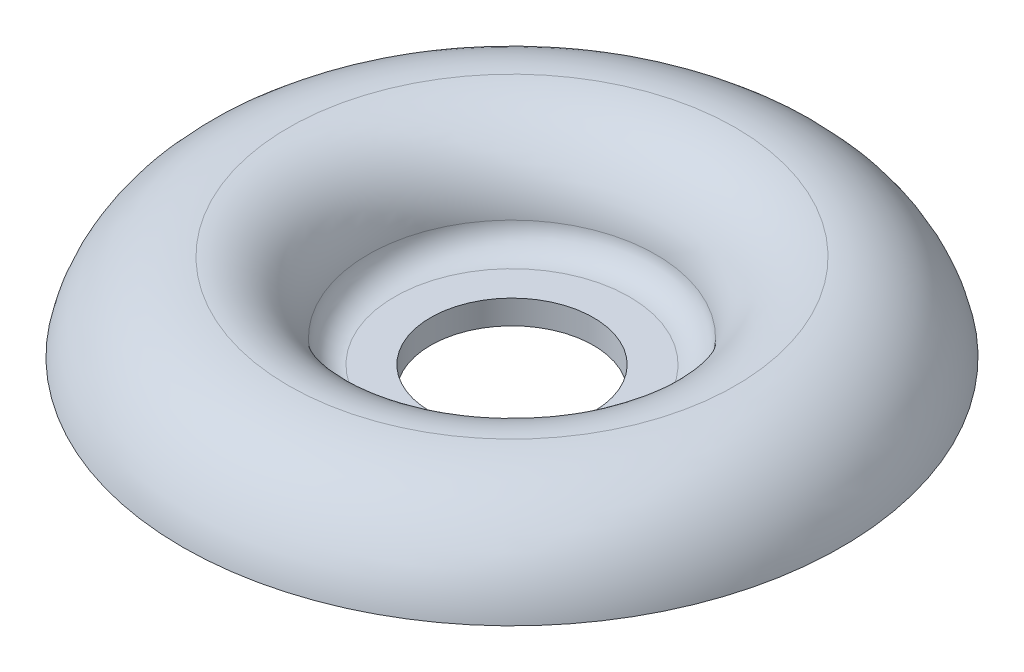
ISO-10303-21;
HEADER;
FILE_DESCRIPTION(('STEP AP214'),'2;1');
FILE_NAME('part.step','',(''),(''),'','','');
FILE_SCHEMA(('AUTOMOTIVE_DESIGN { 1 0 10303 214 1 1 1 1 }'));
ENDSEC;
DATA;
#1=APPLICATION_CONTEXT('core data for automotive mechanical design processes');
#2=APPLICATION_PROTOCOL_DEFINITION('international standard','automotive_design',2000,#1);
#3=PRODUCT_CONTEXT('',#1,'mechanical');
#4=PRODUCT('Part','Part','',(#3));
#5=PRODUCT_RELATED_PRODUCT_CATEGORY('part','',(#4));
#6=PRODUCT_DEFINITION_FORMATION('','',#4);
#7=PRODUCT_DEFINITION_CONTEXT('part definition',#1,'design');
#8=PRODUCT_DEFINITION('design','',#6,#7);
#9=PRODUCT_DEFINITION_SHAPE('','',#8);
#10=(LENGTH_UNIT() NAMED_UNIT(*) SI_UNIT(.MILLI.,.METRE.));
#11=(NAMED_UNIT(*) PLANE_ANGLE_UNIT() SI_UNIT($,.RADIAN.));
#12=(NAMED_UNIT(*) SI_UNIT($,.STERADIAN.) SOLID_ANGLE_UNIT());
#13=UNCERTAINTY_MEASURE_WITH_UNIT(LENGTH_MEASURE(1.E-05),#10,'distance_accuracy_value','');
#14=(GEOMETRIC_REPRESENTATION_CONTEXT(3) GLOBAL_UNCERTAINTY_ASSIGNED_CONTEXT((#13)) GLOBAL_UNIT_ASSIGNED_CONTEXT((#10,
#11,#12)) REPRESENTATION_CONTEXT('',''));
#15=CARTESIAN_POINT('',(0.,0.,0.));
#16=DIRECTION('',(0.,0.,1.));
#17=DIRECTION('',(1.,0.,0.));
#18=AXIS2_PLACEMENT_3D('',#15,#16,#17);
#19=CARTESIAN_POINT('',(0.,36.322,7.747));
#20=DIRECTION('',(0.,1.,0.));
#21=DIRECTION('',(1.,0.,0.));
#22=AXIS2_PLACEMENT_3D('',#19,#20,#21);
#23=PLANE('',#22);
#24=CARTESIAN_POINT('',(0.,36.322,0.));
#25=DIRECTION('',(0.,1.,0.));
#26=DIRECTION('',(0.,0.,1.));
#27=AXIS2_PLACEMENT_3D('',#24,#25,#26);
#28=CIRCLE('',#27,7.747);
#29=CARTESIAN_POINT('',(0.,36.322,7.747));
#30=VERTEX_POINT('',#29);
#31=EDGE_CURVE('E10',#30,#30,#28,.T.);
#32=ORIENTED_EDGE('',*,*,#31,.F.);
#33=EDGE_LOOP('',(#32));
#34=FACE_BOUND('',#33,.T.);
#35=CARTESIAN_POINT('',(0.,36.322,0.));
#36=DIRECTION('',(0.,1.,0.));
#37=DIRECTION('',(0.,0.,1.));
#38=AXIS2_PLACEMENT_3D('',#35,#36,#37);
#39=CIRCLE('',#38,11.1694886859688);
#40=CARTESIAN_POINT('',(0.,36.322,11.1694886859688));
#41=VERTEX_POINT('',#40);
#42=EDGE_CURVE('E90',#41,#41,#39,.T.);
#43=ORIENTED_EDGE('',*,*,#42,.T.);
#44=EDGE_LOOP('',(#43));
#45=FACE_BOUND('',#44,.T.);
#46=ADVANCED_FACE('F47',(#34,#45),#23,.T.);
#47=CARTESIAN_POINT('',(0.,34.036,7.747));
#48=DIRECTION('',(0.,-1.,0.));
#49=DIRECTION('',(0.,0.,-1.));
#50=AXIS2_PLACEMENT_3D('',#47,#48,#49);
#51=PLANE('',#50);
#52=CARTESIAN_POINT('',(0.,34.036,0.));
#53=DIRECTION('',(0.,1.,0.));
#54=DIRECTION('',(0.,0.,1.));
#55=AXIS2_PLACEMENT_3D('',#52,#53,#54);
#56=CIRCLE('',#55,7.747);
#57=CARTESIAN_POINT('',(0.,34.036,7.747));
#58=VERTEX_POINT('',#57);
#59=EDGE_CURVE('E54',#58,#58,#56,.T.);
#60=ORIENTED_EDGE('',*,*,#59,.T.);
#61=EDGE_LOOP('',(#60));
#62=FACE_BOUND('',#61,.T.);
#63=CARTESIAN_POINT('',(0.,34.036,0.));
#64=DIRECTION('',(0.,1.,0.));
#65=DIRECTION('',(0.,0.,1.));
#66=AXIS2_PLACEMENT_3D('',#63,#64,#65);
#67=CIRCLE('',#66,11.1694886859688);
#68=CARTESIAN_POINT('',(0.,34.036,11.1694886859688));
#69=VERTEX_POINT('',#68);
#70=EDGE_CURVE('E61',#69,#69,#67,.T.);
#71=ORIENTED_EDGE('',*,*,#70,.F.);
#72=EDGE_LOOP('',(#71));
#73=FACE_BOUND('',#72,.T.);
#74=ADVANCED_FACE('F114',(#62,#73),#51,.T.);
#75=CARTESIAN_POINT('',(0.,49.276,0.));
#76=DIRECTION('',(0.,1.,0.));
#77=DIRECTION('',(0.,0.,1.));
#78=AXIS2_PLACEMENT_3D('',#75,#76,#77);
#79=CYLINDRICAL_SURFACE('',#78,7.747);
#80=ORIENTED_EDGE('',*,*,#31,.T.);
#81=EDGE_LOOP('',(#80));
#82=FACE_BOUND('',#81,.T.);
#83=ORIENTED_EDGE('',*,*,#59,.F.);
#84=EDGE_LOOP('',(#83));
#85=FACE_BOUND('',#84,.T.);
#86=ADVANCED_FACE('F104',(#82,#85),#79,.F.);
#87=CARTESIAN_POINT('',(0.,38.862,0.));
#88=DIRECTION('',(0.,1.,0.));
#89=DIRECTION('',(0.,0.,1.));
#90=AXIS2_PLACEMENT_3D('',#87,#88,#89);
#91=TOROIDAL_SURFACE('',#90,11.1694886859688,4.826);
#92=ORIENTED_EDGE('',*,*,#70,.T.);
#93=EDGE_LOOP('',(#92));
#94=FACE_BOUND('',#93,.T.);
#95=CARTESIAN_POINT('',(0.,38.256755035549,0.));
#96=DIRECTION('',(0.,1.,0.));
#97=DIRECTION('',(0.,0.,1.));
#98=AXIS2_PLACEMENT_3D('',#95,#96,#97);
#99=CIRCLE('',#98,15.9573853570559);
#100=CARTESIAN_POINT('',(0.,38.256755035549,15.9573853570559));
#101=VERTEX_POINT('',#100);
#102=EDGE_CURVE('E67',#101,#101,#99,.T.);
#103=ORIENTED_EDGE('',*,*,#102,.F.);
#104=EDGE_LOOP('',(#103));
#105=FACE_BOUND('',#104,.T.);
#106=ADVANCED_FACE('F102',(#94,#105),#91,.T.);
#107=CARTESIAN_POINT('',(0.,37.5871970526239,0.));
#108=DIRECTION('',(0.,1.,0.));
#109=DIRECTION('',(0.,0.,1.));
#110=AXIS2_PLACEMENT_3D('',#107,#108,#109);
#111=TOROIDAL_SURFACE('',#110,21.2540360929844,5.338802947376);
#112=ORIENTED_EDGE('',*,*,#102,.T.);
#113=EDGE_LOOP('',(#112));
#114=FACE_BOUND('',#113,.T.);
#115=CARTESIAN_POINT('',(0.,42.926,0.));
#116=DIRECTION('',(0.,1.,0.));
#117=DIRECTION('',(0.,0.,1.));
#118=AXIS2_PLACEMENT_3D('',#115,#116,#117);
#119=CIRCLE('',#118,21.2540360929844);
#120=CARTESIAN_POINT('',(0.,42.926,21.2540360929844));
#121=VERTEX_POINT('',#120);
#122=EDGE_CURVE('E70',#121,#121,#119,.T.);
#123=ORIENTED_EDGE('',*,*,#122,.F.);
#124=EDGE_LOOP('',(#123));
#125=FACE_BOUND('',#124,.T.);
#126=ADVANCED_FACE('F99',(#114,#125),#111,.F.);
#127=CARTESIAN_POINT('',(0.,34.9232667156911,0.));
#128=DIRECTION('',(0.,1.,0.));
#129=DIRECTION('',(0.,0.,1.));
#130=AXIS2_PLACEMENT_3D('',#127,#128,#129);
#131=TOROIDAL_SURFACE('',#130,21.2540360929844,8.00273328430894);
#132=ORIENTED_EDGE('',*,*,#122,.T.);
#133=EDGE_LOOP('',(#132));
#134=FACE_BOUND('',#133,.T.);
#135=CARTESIAN_POINT('',(0.,36.1696,0.));
#136=DIRECTION('',(0.,1.,0.));
#137=DIRECTION('',(0.,0.,1.));
#138=AXIS2_PLACEMENT_3D('',#135,#136,#137);
#139=CIRCLE('',#138,29.1591226430615);
#140=CARTESIAN_POINT('',(0.,36.1696,29.1591226430615));
#141=VERTEX_POINT('',#140);
#142=EDGE_CURVE('E74',#141,#141,#139,.T.);
#143=ORIENTED_EDGE('',*,*,#142,.F.);
#144=EDGE_LOOP('',(#143));
#145=FACE_BOUND('',#144,.T.);
#146=ADVANCED_FACE('F112',(#134,#145),#131,.F.);
#147=CARTESIAN_POINT('',(0.,36.9628588786739,0.));
#148=DIRECTION('',(0.,1.,0.));
#149=DIRECTION('',(0.,0.,1.));
#150=AXIS2_PLACEMENT_3D('',#147,#148,#149);
#151=CONICAL_SURFACE('',#150,31.3385835,1.22173047639603);
#152=ORIENTED_EDGE('',*,*,#142,.T.);
#153=EDGE_LOOP('',(#152));
#154=FACE_BOUND('',#153,.T.);
#155=CARTESIAN_POINT('',(0.,36.9628588786739,0.));
#156=DIRECTION('',(0.,1.,0.));
#157=DIRECTION('',(0.,0.,1.));
#158=AXIS2_PLACEMENT_3D('',#155,#156,#157);
#159=CIRCLE('',#158,31.3385835);
#160=CARTESIAN_POINT('',(0.,36.9628588786739,31.3385835));
#161=VERTEX_POINT('',#160);
#162=EDGE_CURVE('E78',#161,#161,#159,.T.);
#163=ORIENTED_EDGE('',*,*,#162,.F.);
#164=EDGE_LOOP('',(#163));
#165=FACE_BOUND('',#164,.T.);
#166=ADVANCED_FACE('F140',(#154,#165),#151,.T.);
#167=CARTESIAN_POINT('',(0.,34.9232667156911,0.));
#168=DIRECTION('',(0.,1.,0.));
#169=DIRECTION('',(0.,0.,1.));
#170=AXIS2_PLACEMENT_3D('',#167,#168,#169);
#171=TOROIDAL_SURFACE('',#170,21.2540360929844,10.2887332843089);
#172=ORIENTED_EDGE('',*,*,#162,.T.);
#173=EDGE_LOOP('',(#172));
#174=FACE_BOUND('',#173,.T.);
#175=CARTESIAN_POINT('',(0.,45.212,0.));
#176=DIRECTION('',(0.,1.,0.));
#177=DIRECTION('',(0.,0.,1.));
#178=AXIS2_PLACEMENT_3D('',#175,#176,#177);
#179=CIRCLE('',#178,21.2540360929844);
#180=CARTESIAN_POINT('',(0.,45.212,21.2540360929844));
#181=VERTEX_POINT('',#180);
#182=EDGE_CURVE('E82',#181,#181,#179,.T.);
#183=ORIENTED_EDGE('',*,*,#182,.F.);
#184=EDGE_LOOP('',(#183));
#185=FACE_BOUND('',#184,.T.);
#186=ADVANCED_FACE('F134',(#174,#185),#171,.T.);
#187=CARTESIAN_POINT('',(0.,37.5871970526239,0.));
#188=DIRECTION('',(0.,1.,0.));
#189=DIRECTION('',(0.,0.,1.));
#190=AXIS2_PLACEMENT_3D('',#187,#188,#189);
#191=TOROIDAL_SURFACE('',#190,21.2540360929844,7.624802947376);
#192=ORIENTED_EDGE('',*,*,#182,.T.);
#193=EDGE_LOOP('',(#192));
#194=FACE_BOUND('',#193,.T.);
#195=CARTESIAN_POINT('',(0.,38.5434498516992,0.));
#196=DIRECTION('',(0.,1.,0.));
#197=DIRECTION('',(0.,0.,1.));
#198=AXIS2_PLACEMENT_3D('',#195,#196,#197);
#199=CIRCLE('',#198,13.6894342812183);
#200=CARTESIAN_POINT('',(0.,38.5434498516992,13.6894342812183));
#201=VERTEX_POINT('',#200);
#202=EDGE_CURVE('E86',#201,#201,#199,.T.);
#203=ORIENTED_EDGE('',*,*,#202,.F.);
#204=EDGE_LOOP('',(#203));
#205=FACE_BOUND('',#204,.T.);
#206=ADVANCED_FACE('F127',(#194,#205),#191,.T.);
#207=CARTESIAN_POINT('',(0.,38.862,0.));
#208=DIRECTION('',(0.,1.,0.));
#209=DIRECTION('',(0.,0.,1.));
#210=AXIS2_PLACEMENT_3D('',#207,#208,#209);
#211=TOROIDAL_SURFACE('',#210,11.1694886859688,2.54);
#212=ORIENTED_EDGE('',*,*,#202,.T.);
#213=EDGE_LOOP('',(#212));
#214=FACE_BOUND('',#213,.T.);
#215=ORIENTED_EDGE('',*,*,#42,.F.);
#216=EDGE_LOOP('',(#215));
#217=FACE_BOUND('',#216,.T.);
#218=ADVANCED_FACE('F125',(#214,#217),#211,.F.);
#219=CLOSED_SHELL('',(#46,#74,#86,#106,#126,#146,#166,#186,#206,#218));
#220=MANIFOLD_SOLID_BREP('B2',#219);
#221=ADVANCED_BREP_SHAPE_REPRESENTATION('',(#18,#220),#14);
#222=SHAPE_DEFINITION_REPRESENTATION(#9,#221);
ENDSEC;
END-ISO-10303-21;
